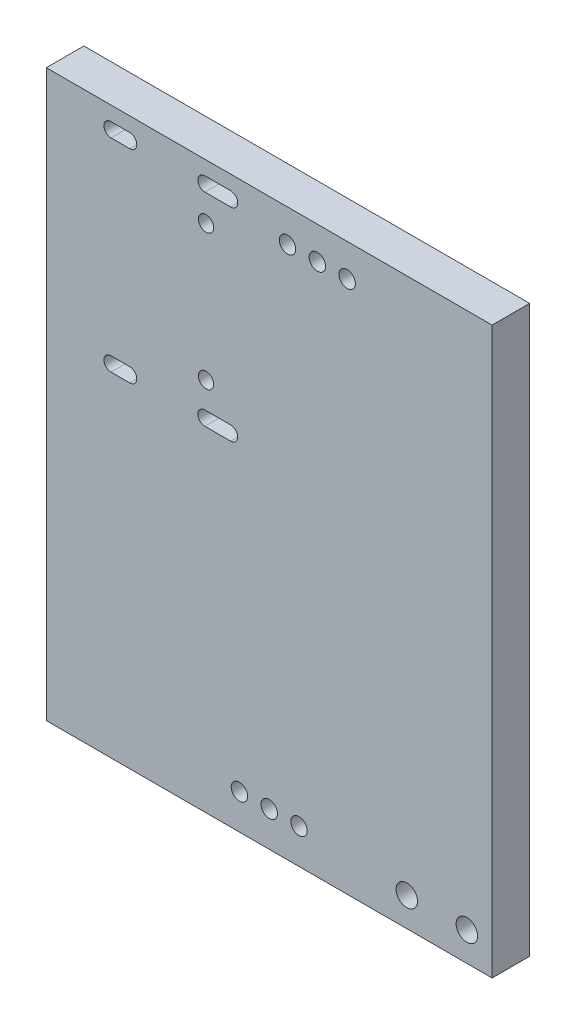
ISO-10303-21;
HEADER;
FILE_DESCRIPTION(('STEP AP214'),'2;1');
FILE_NAME('part.step','',(''),(''),'','','');
FILE_SCHEMA(('AUTOMOTIVE_DESIGN { 1 0 10303 214 1 1 1 1 }'));
ENDSEC;
DATA;
#1=APPLICATION_CONTEXT('core data for automotive mechanical design processes');
#2=APPLICATION_PROTOCOL_DEFINITION('international standard','automotive_design',2000,#1);
#3=PRODUCT_CONTEXT('',#1,'mechanical');
#4=PRODUCT('Part','Part','',(#3));
#5=PRODUCT_RELATED_PRODUCT_CATEGORY('part','',(#4));
#6=PRODUCT_DEFINITION_FORMATION('','',#4);
#7=PRODUCT_DEFINITION_CONTEXT('part definition',#1,'design');
#8=PRODUCT_DEFINITION('design','',#6,#7);
#9=PRODUCT_DEFINITION_SHAPE('','',#8);
#10=(LENGTH_UNIT() NAMED_UNIT(*) SI_UNIT(.MILLI.,.METRE.));
#11=(NAMED_UNIT(*) PLANE_ANGLE_UNIT() SI_UNIT($,.RADIAN.));
#12=(NAMED_UNIT(*) SI_UNIT($,.STERADIAN.) SOLID_ANGLE_UNIT());
#13=UNCERTAINTY_MEASURE_WITH_UNIT(LENGTH_MEASURE(1.E-05),#10,'distance_accuracy_value','');
#14=(GEOMETRIC_REPRESENTATION_CONTEXT(3) GLOBAL_UNCERTAINTY_ASSIGNED_CONTEXT((#13)) GLOBAL_UNIT_ASSIGNED_CONTEXT((#10,
#11,#12)) REPRESENTATION_CONTEXT('',''));
#15=CARTESIAN_POINT('',(0.,0.,0.));
#16=DIRECTION('',(0.,0.,1.));
#17=DIRECTION('',(1.,0.,0.));
#18=AXIS2_PLACEMENT_3D('',#15,#16,#17);
#19=CARTESIAN_POINT('',(-8.790662941326,19.526245872492,0.));
#20=DIRECTION('',(0.,0.,-1.));
#21=DIRECTION('',(-1.,0.,0.));
#22=AXIS2_PLACEMENT_3D('',#19,#20,#21);
#23=CYLINDRICAL_SURFACE('',#22,0.3);
#24=CARTESIAN_POINT('',(-8.790662941326,19.526245872492,1.600028244856));
#25=DIRECTION('',(0.,0.,-1.));
#26=DIRECTION('',(-1.,0.,0.));
#27=AXIS2_PLACEMENT_3D('',#24,#25,#26);
#28=CIRCLE('',#27,0.3);
#29=CARTESIAN_POINT('',(-8.790662941326,19.226245872492,1.600028244856));
#30=VERTEX_POINT('',#29);
#31=CARTESIAN_POINT('',(-8.790662941326,19.826245872492,1.600028244856));
#32=VERTEX_POINT('',#31);
#33=EDGE_CURVE('E144',#30,#32,#28,.T.);
#34=ORIENTED_EDGE('',*,*,#33,.F.);
#35=DIRECTION('',(0.,0.,1.));
#36=VECTOR('',#35,1.);
#37=CARTESIAN_POINT('',(-8.790662941326,19.226245872492,0.));
#38=LINE('',#37,#36);
#39=CARTESIAN_POINT('',(-8.790662941326,19.226245872492,0.));
#40=VERTEX_POINT('',#39);
#41=EDGE_CURVE('E146',#40,#30,#38,.T.);
#42=ORIENTED_EDGE('',*,*,#41,.F.);
#43=CARTESIAN_POINT('',(-8.790662941326,19.526245872492,0.));
#44=DIRECTION('',(0.,0.,-1.));
#45=DIRECTION('',(-1.,0.,0.));
#46=AXIS2_PLACEMENT_3D('',#43,#44,#45);
#47=CIRCLE('',#46,0.3);
#48=CARTESIAN_POINT('',(-8.790662941326,19.826245872492,0.));
#49=VERTEX_POINT('',#48);
#50=EDGE_CURVE('E20',#49,#40,#47,.F.);
#51=ORIENTED_EDGE('',*,*,#50,.F.);
#52=DIRECTION('',(0.,0.,-1.));
#53=VECTOR('',#52,1.);
#54=CARTESIAN_POINT('',(-8.790662941326,19.826245872492,0.));
#55=LINE('',#54,#53);
#56=EDGE_CURVE('E151',#32,#49,#55,.T.);
#57=ORIENTED_EDGE('',*,*,#56,.F.);
#58=EDGE_LOOP('',(#34,#42,#51,#57));
#59=FACE_BOUND('',#58,.T.);
#60=ADVANCED_FACE('F17',(#59),#23,.F.);
#61=CARTESIAN_POINT('',(-8.790662941326,10.886164592329,0.));
#62=DIRECTION('',(0.,0.,-1.));
#63=DIRECTION('',(-1.,0.,0.));
#64=AXIS2_PLACEMENT_3D('',#61,#62,#63);
#65=CYLINDRICAL_SURFACE('',#64,0.3);
#66=CARTESIAN_POINT('',(-8.790662941326,10.886164592329,1.600028244856));
#67=DIRECTION('',(0.,0.,-1.));
#68=DIRECTION('',(-1.,0.,0.));
#69=AXIS2_PLACEMENT_3D('',#66,#67,#68);
#70=CIRCLE('',#69,0.3);
#71=CARTESIAN_POINT('',(-8.790662941326,10.586164592329,1.600028244856));
#72=VERTEX_POINT('',#71);
#73=CARTESIAN_POINT('',(-8.790662941326,11.186164592329,1.600028244856));
#74=VERTEX_POINT('',#73);
#75=EDGE_CURVE('E192',#72,#74,#70,.T.);
#76=ORIENTED_EDGE('',*,*,#75,.F.);
#77=DIRECTION('',(0.,0.,1.));
#78=VECTOR('',#77,1.);
#79=CARTESIAN_POINT('',(-8.790662941326,10.586164592329,0.));
#80=LINE('',#79,#78);
#81=CARTESIAN_POINT('',(-8.790662941326,10.586164592329,0.));
#82=VERTEX_POINT('',#81);
#83=EDGE_CURVE('E185',#82,#72,#80,.T.);
#84=ORIENTED_EDGE('',*,*,#83,.F.);
#85=CARTESIAN_POINT('',(-8.790662941326,10.886164592329,0.));
#86=DIRECTION('',(0.,0.,-1.));
#87=DIRECTION('',(-1.,0.,0.));
#88=AXIS2_PLACEMENT_3D('',#85,#86,#87);
#89=CIRCLE('',#88,0.3);
#90=CARTESIAN_POINT('',(-8.790662941326,11.186164592329,0.));
#91=VERTEX_POINT('',#90);
#92=EDGE_CURVE('E294',#91,#82,#89,.F.);
#93=ORIENTED_EDGE('',*,*,#92,.F.);
#94=DIRECTION('',(0.,0.,-1.));
#95=VECTOR('',#94,1.);
#96=CARTESIAN_POINT('',(-8.790662941326,11.186164592329,0.));
#97=LINE('',#96,#95);
#98=EDGE_CURVE('E188',#74,#91,#97,.T.);
#99=ORIENTED_EDGE('',*,*,#98,.F.);
#100=EDGE_LOOP('',(#76,#84,#93,#99));
#101=FACE_BOUND('',#100,.T.);
#102=ADVANCED_FACE('F716',(#101),#65,.F.);
#103=CARTESIAN_POINT('',(-7.990662941326,19.826245872492,0.));
#104=DIRECTION('',(0.,-1.,0.));
#105=DIRECTION('',(0.,0.,-1.));
#106=AXIS2_PLACEMENT_3D('',#103,#104,#105);
#107=PLANE('',#106);
#108=ORIENTED_EDGE('',*,*,#56,.T.);
#109=DIRECTION('',(-1.,0.,0.));
#110=VECTOR('',#109,1.);
#111=CARTESIAN_POINT('',(-2.049004318009,19.826245872492,0.));
#112=LINE('',#111,#110);
#113=CARTESIAN_POINT('',(-7.990662941326,19.826245872492,0.));
#114=VERTEX_POINT('',#113);
#115=EDGE_CURVE('E143',#114,#49,#112,.T.);
#116=ORIENTED_EDGE('',*,*,#115,.F.);
#117=DIRECTION('',(0.,0.,-1.));
#118=VECTOR('',#117,1.);
#119=CARTESIAN_POINT('',(-7.990662941326,19.826245872492,0.));
#120=LINE('',#119,#118);
#121=CARTESIAN_POINT('',(-7.990662941326,19.826245872492,1.600028244856));
#122=VERTEX_POINT('',#121);
#123=EDGE_CURVE('E283',#114,#122,#120,.F.);
#124=ORIENTED_EDGE('',*,*,#123,.T.);
#125=DIRECTION('',(1.,0.,0.));
#126=VECTOR('',#125,1.);
#127=CARTESIAN_POINT('',(-7.990662941326,19.826245872492,1.600028244856));
#128=LINE('',#127,#126);
#129=EDGE_CURVE('E190',#122,#32,#128,.F.);
#130=ORIENTED_EDGE('',*,*,#129,.T.);
#131=EDGE_LOOP('',(#108,#116,#124,#130));
#132=FACE_BOUND('',#131,.T.);
#133=ADVANCED_FACE('F301',(#132),#107,.T.);
#134=CARTESIAN_POINT('',(-8.790662941326,19.226245872492,0.));
#135=DIRECTION('',(0.,1.,0.));
#136=DIRECTION('',(0.,0.,1.));
#137=AXIS2_PLACEMENT_3D('',#134,#135,#136);
#138=PLANE('',#137);
#139=DIRECTION('',(0.,0.,-1.));
#140=VECTOR('',#139,1.);
#141=CARTESIAN_POINT('',(-7.990662941326,19.226245872492,0.));
#142=LINE('',#141,#140);
#143=CARTESIAN_POINT('',(-7.990662941326,19.226245872492,1.600028244856));
#144=VERTEX_POINT('',#143);
#145=CARTESIAN_POINT('',(-7.990662941326,19.226245872492,0.));
#146=VERTEX_POINT('',#145);
#147=EDGE_CURVE('E156',#144,#146,#142,.T.);
#148=ORIENTED_EDGE('',*,*,#147,.T.);
#149=DIRECTION('',(-1.,0.,0.));
#150=VECTOR('',#149,1.);
#151=CARTESIAN_POINT('',(-2.049004318009,19.226245872492,0.));
#152=LINE('',#151,#150);
#153=EDGE_CURVE('E141',#40,#146,#152,.F.);
#154=ORIENTED_EDGE('',*,*,#153,.F.);
#155=ORIENTED_EDGE('',*,*,#41,.T.);
#156=DIRECTION('',(1.,0.,0.));
#157=VECTOR('',#156,1.);
#158=CARTESIAN_POINT('',(-8.790662941326,19.226245872492,1.600028244856));
#159=LINE('',#158,#157);
#160=EDGE_CURVE('E150',#30,#144,#159,.T.);
#161=ORIENTED_EDGE('',*,*,#160,.T.);
#162=EDGE_LOOP('',(#148,#154,#155,#161));
#163=FACE_BOUND('',#162,.T.);
#164=ADVANCED_FACE('F154',(#163),#138,.T.);
#165=CARTESIAN_POINT('',(-7.990662941326,11.186164592329,0.));
#166=DIRECTION('',(0.,-1.,0.));
#167=DIRECTION('',(0.,0.,-1.));
#168=AXIS2_PLACEMENT_3D('',#165,#166,#167);
#169=PLANE('',#168);
#170=ORIENTED_EDGE('',*,*,#98,.T.);
#171=DIRECTION('',(-1.,0.,0.));
#172=VECTOR('',#171,1.);
#173=CARTESIAN_POINT('',(-2.049004318009,11.186164592329,0.));
#174=LINE('',#173,#172);
#175=CARTESIAN_POINT('',(-7.990662941326,11.186164592329,0.));
#176=VERTEX_POINT('',#175);
#177=EDGE_CURVE('E157',#176,#91,#174,.T.);
#178=ORIENTED_EDGE('',*,*,#177,.F.);
#179=DIRECTION('',(0.,0.,-1.));
#180=VECTOR('',#179,1.);
#181=CARTESIAN_POINT('',(-7.990662941326,11.186164592329,0.));
#182=LINE('',#181,#180);
#183=CARTESIAN_POINT('',(-7.990662941326,11.186164592329,1.600028244856));
#184=VERTEX_POINT('',#183);
#185=EDGE_CURVE('E280',#176,#184,#182,.F.);
#186=ORIENTED_EDGE('',*,*,#185,.T.);
#187=DIRECTION('',(1.,0.,0.));
#188=VECTOR('',#187,1.);
#189=CARTESIAN_POINT('',(-7.990662941326,11.186164592329,1.600028244856));
#190=LINE('',#189,#188);
#191=EDGE_CURVE('E186',#184,#74,#190,.F.);
#192=ORIENTED_EDGE('',*,*,#191,.T.);
#193=EDGE_LOOP('',(#170,#178,#186,#192));
#194=FACE_BOUND('',#193,.T.);
#195=ADVANCED_FACE('F690',(#194),#169,.T.);
#196=CARTESIAN_POINT('',(-8.790662941326,10.586164592329,0.));
#197=DIRECTION('',(0.,1.,0.));
#198=DIRECTION('',(0.,0.,1.));
#199=AXIS2_PLACEMENT_3D('',#196,#197,#198);
#200=PLANE('',#199);
#201=DIRECTION('',(0.,0.,-1.));
#202=VECTOR('',#201,1.);
#203=CARTESIAN_POINT('',(-7.990662941326,10.586164592329,0.));
#204=LINE('',#203,#202);
#205=CARTESIAN_POINT('',(-7.990662941326,10.586164592329,1.600028244856));
#206=VERTEX_POINT('',#205);
#207=CARTESIAN_POINT('',(-7.990662941326,10.586164592329,0.));
#208=VERTEX_POINT('',#207);
#209=EDGE_CURVE('E340',#206,#208,#204,.T.);
#210=ORIENTED_EDGE('',*,*,#209,.T.);
#211=DIRECTION('',(-1.,0.,0.));
#212=VECTOR('',#211,1.);
#213=CARTESIAN_POINT('',(-2.049004318009,10.586164592329,0.));
#214=LINE('',#213,#212);
#215=EDGE_CURVE('E160',#82,#208,#214,.F.);
#216=ORIENTED_EDGE('',*,*,#215,.F.);
#217=ORIENTED_EDGE('',*,*,#83,.T.);
#218=DIRECTION('',(1.,0.,0.));
#219=VECTOR('',#218,1.);
#220=CARTESIAN_POINT('',(-8.790662941326,10.586164592329,1.600028244856));
#221=LINE('',#220,#219);
#222=EDGE_CURVE('E182',#72,#206,#221,.T.);
#223=ORIENTED_EDGE('',*,*,#222,.T.);
#224=EDGE_LOOP('',(#210,#216,#217,#223));
#225=FACE_BOUND('',#224,.T.);
#226=ADVANCED_FACE('F343',(#225),#200,.T.);
#227=CARTESIAN_POINT('',(-4.790815341631,19.526245872492,0.));
#228=DIRECTION('',(0.,0.,-1.));
#229=DIRECTION('',(-1.,0.,0.));
#230=AXIS2_PLACEMENT_3D('',#227,#228,#229);
#231=CYLINDRICAL_SURFACE('',#230,0.3);
#232=CARTESIAN_POINT('',(-4.790815341631,19.526245872492,1.600028244856));
#233=DIRECTION('',(0.,0.,-1.));
#234=DIRECTION('',(-1.,0.,0.));
#235=AXIS2_PLACEMENT_3D('',#232,#233,#234);
#236=CIRCLE('',#235,0.3);
#237=CARTESIAN_POINT('',(-4.790815341631,19.226245872492,1.600028244856));
#238=VERTEX_POINT('',#237);
#239=CARTESIAN_POINT('',(-4.790815341631,19.826245872492,1.600028244856));
#240=VERTEX_POINT('',#239);
#241=EDGE_CURVE('E184',#238,#240,#236,.T.);
#242=ORIENTED_EDGE('',*,*,#241,.F.);
#243=DIRECTION('',(0.,0.,1.));
#244=VECTOR('',#243,1.);
#245=CARTESIAN_POINT('',(-4.790815341631,19.226245872492,0.));
#246=LINE('',#245,#244);
#247=CARTESIAN_POINT('',(-4.790815341631,19.226245872492,0.));
#248=VERTEX_POINT('',#247);
#249=EDGE_CURVE('E178',#248,#238,#246,.T.);
#250=ORIENTED_EDGE('',*,*,#249,.F.);
#251=CARTESIAN_POINT('',(-4.790815341631,19.526245872492,0.));
#252=DIRECTION('',(0.,0.,-1.));
#253=DIRECTION('',(-1.,0.,0.));
#254=AXIS2_PLACEMENT_3D('',#251,#252,#253);
#255=CIRCLE('',#254,0.3);
#256=CARTESIAN_POINT('',(-4.790815341631,19.826245872492,0.));
#257=VERTEX_POINT('',#256);
#258=EDGE_CURVE('E288',#257,#248,#255,.F.);
#259=ORIENTED_EDGE('',*,*,#258,.F.);
#260=DIRECTION('',(0.,0.,-1.));
#261=VECTOR('',#260,1.);
#262=CARTESIAN_POINT('',(-4.790815341631,19.826245872492,0.));
#263=LINE('',#262,#261);
#264=EDGE_CURVE('E181',#240,#257,#263,.T.);
#265=ORIENTED_EDGE('',*,*,#264,.F.);
#266=EDGE_LOOP('',(#242,#250,#259,#265));
#267=FACE_BOUND('',#266,.T.);
#268=ADVANCED_FACE('F673',(#267),#231,.F.);
#269=CARTESIAN_POINT('',(-4.790815341631,10.886164592329,0.));
#270=DIRECTION('',(0.,0.,-1.));
#271=DIRECTION('',(-1.,0.,0.));
#272=AXIS2_PLACEMENT_3D('',#269,#270,#271);
#273=CYLINDRICAL_SURFACE('',#272,0.3);
#274=CARTESIAN_POINT('',(-4.790815341631,10.886164592329,1.600028244856));
#275=DIRECTION('',(0.,0.,-1.));
#276=DIRECTION('',(-1.,0.,0.));
#277=AXIS2_PLACEMENT_3D('',#274,#275,#276);
#278=CIRCLE('',#277,0.3);
#279=CARTESIAN_POINT('',(-4.790815341631,10.586164592329,1.600028244856));
#280=VERTEX_POINT('',#279);
#281=CARTESIAN_POINT('',(-4.790815341631,11.186164592329,1.600028244856));
#282=VERTEX_POINT('',#281);
#283=EDGE_CURVE('E162',#280,#282,#278,.T.);
#284=ORIENTED_EDGE('',*,*,#283,.F.);
#285=DIRECTION('',(0.,0.,1.));
#286=VECTOR('',#285,1.);
#287=CARTESIAN_POINT('',(-4.790815341631,10.586164592329,0.));
#288=LINE('',#287,#286);
#289=CARTESIAN_POINT('',(-4.790815341631,10.586164592329,0.));
#290=VERTEX_POINT('',#289);
#291=EDGE_CURVE('E170',#290,#280,#288,.T.);
#292=ORIENTED_EDGE('',*,*,#291,.F.);
#293=CARTESIAN_POINT('',(-4.790815341631,10.886164592329,0.));
#294=DIRECTION('',(0.,0.,-1.));
#295=DIRECTION('',(-1.,0.,0.));
#296=AXIS2_PLACEMENT_3D('',#293,#294,#295);
#297=CIRCLE('',#296,0.3);
#298=CARTESIAN_POINT('',(-4.790815341631,11.186164592329,0.));
#299=VERTEX_POINT('',#298);
#300=EDGE_CURVE('E285',#299,#290,#297,.F.);
#301=ORIENTED_EDGE('',*,*,#300,.F.);
#302=DIRECTION('',(0.,0.,-1.));
#303=VECTOR('',#302,1.);
#304=CARTESIAN_POINT('',(-4.790815341631,11.186164592329,0.));
#305=LINE('',#304,#303);
#306=EDGE_CURVE('E173',#282,#299,#305,.T.);
#307=ORIENTED_EDGE('',*,*,#306,.F.);
#308=EDGE_LOOP('',(#284,#292,#301,#307));
#309=FACE_BOUND('',#308,.T.);
#310=ADVANCED_FACE('F394',(#309),#273,.F.);
#311=CARTESIAN_POINT('',(-2.049004318009,8.394079248158,0.));
#312=DIRECTION('',(0.,0.,-1.));
#313=DIRECTION('',(-1.,0.,0.));
#314=AXIS2_PLACEMENT_3D('',#311,#312,#313);
#315=PLANE('',#314);
#316=CARTESIAN_POINT('',(6.371145542291,-2.41300482601,0.));
#317=DIRECTION('',(0.,0.,-1.));
#318=DIRECTION('',(-1.,0.,0.));
#319=AXIS2_PLACEMENT_3D('',#316,#317,#318);
#320=CIRCLE('',#319,0.457200914402);
#321=CARTESIAN_POINT('',(5.913944627889,-2.41300482601,0.));
#322=VERTEX_POINT('',#321);
#323=EDGE_CURVE('E240',#322,#322,#320,.F.);
#324=ORIENTED_EDGE('',*,*,#323,.T.);
#325=EDGE_LOOP('',(#324));
#326=FACE_BOUND('',#325,.T.);
#327=CARTESIAN_POINT('',(3.810007620015,-2.41300482601,0.));
#328=DIRECTION('',(0.,0.,-1.));
#329=DIRECTION('',(-1.,0.,0.));
#330=AXIS2_PLACEMENT_3D('',#327,#328,#329);
#331=CIRCLE('',#330,0.457200914402);
#332=CARTESIAN_POINT('',(3.352806705613,-2.41300482601,0.));
#333=VERTEX_POINT('',#332);
#334=EDGE_CURVE('E244',#333,#333,#331,.F.);
#335=ORIENTED_EDGE('',*,*,#334,.T.);
#336=EDGE_LOOP('',(#335));
#337=FACE_BOUND('',#336,.T.);
#338=CARTESIAN_POINT('',(1.270002540005,19.050038100076,0.));
#339=DIRECTION('',(0.,0.,-1.));
#340=DIRECTION('',(-1.,0.,0.));
#341=AXIS2_PLACEMENT_3D('',#338,#339,#340);
#342=CIRCLE('',#341,0.350012700025);
#343=CARTESIAN_POINT('',(0.91998983998,19.050038100076,0.));
#344=VERTEX_POINT('',#343);
#345=EDGE_CURVE('E247',#344,#344,#342,.F.);
#346=ORIENTED_EDGE('',*,*,#345,.T.);
#347=EDGE_LOOP('',(#346));
#348=FACE_BOUND('',#347,.T.);
#349=CARTESIAN_POINT('',(0.,19.050038100076,0.));
#350=DIRECTION('',(0.,0.,-1.));
#351=DIRECTION('',(-1.,0.,0.));
#352=AXIS2_PLACEMENT_3D('',#349,#350,#351);
#353=CIRCLE('',#352,0.350012700025);
#354=CARTESIAN_POINT('',(-0.350012700025,19.050038100076,0.));
#355=VERTEX_POINT('',#354);
#356=EDGE_CURVE('E250',#355,#355,#353,.F.);
#357=ORIENTED_EDGE('',*,*,#356,.T.);
#358=EDGE_LOOP('',(#357));
#359=FACE_BOUND('',#358,.T.);
#360=CARTESIAN_POINT('',(-0.77887477775,-2.159004318009,0.));
#361=DIRECTION('',(0.,0.,-1.));
#362=DIRECTION('',(-1.,0.,0.));
#363=AXIS2_PLACEMENT_3D('',#360,#361,#362);
#364=CIRCLE('',#363,0.350012700025);
#365=CARTESIAN_POINT('',(-1.128887477775,-2.159004318009,0.));
#366=VERTEX_POINT('',#365);
#367=EDGE_CURVE('E253',#366,#366,#364,.F.);
#368=ORIENTED_EDGE('',*,*,#367,.T.);
#369=EDGE_LOOP('',(#368));
#370=FACE_BOUND('',#369,.T.);
#371=CARTESIAN_POINT('',(-1.270002540005,19.050038100076,0.));
#372=DIRECTION('',(0.,0.,-1.));
#373=DIRECTION('',(-1.,0.,0.));
#374=AXIS2_PLACEMENT_3D('',#371,#372,#373);
#375=CIRCLE('',#374,0.350012700025);
#376=CARTESIAN_POINT('',(-1.62001524003,19.050038100076,0.));
#377=VERTEX_POINT('',#376);
#378=EDGE_CURVE('E256',#377,#377,#375,.F.);
#379=ORIENTED_EDGE('',*,*,#378,.T.);
#380=EDGE_LOOP('',(#379));
#381=FACE_BOUND('',#380,.T.);
#382=CARTESIAN_POINT('',(-2.048877317755,-2.159004318009,0.));
#383=DIRECTION('',(0.,0.,-1.));
#384=DIRECTION('',(-1.,0.,0.));
#385=AXIS2_PLACEMENT_3D('',#382,#383,#384);
#386=CIRCLE('',#385,0.350012700025);
#387=CARTESIAN_POINT('',(-2.39889001778,-2.159004318009,0.));
#388=VERTEX_POINT('',#387);
#389=EDGE_CURVE('E259',#388,#388,#386,.F.);
#390=ORIENTED_EDGE('',*,*,#389,.T.);
#391=EDGE_LOOP('',(#390));
#392=FACE_BOUND('',#391,.T.);
#393=CARTESIAN_POINT('',(-3.31887985776,-2.159004318009,0.));
#394=DIRECTION('',(0.,0.,-1.));
#395=DIRECTION('',(-1.,0.,0.));
#396=AXIS2_PLACEMENT_3D('',#393,#394,#395);
#397=CIRCLE('',#396,0.350012700025);
#398=CARTESIAN_POINT('',(-3.668892557785,-2.159004318009,0.));
#399=VERTEX_POINT('',#398);
#400=EDGE_CURVE('E262',#399,#399,#397,.F.);
#401=ORIENTED_EDGE('',*,*,#400,.T.);
#402=EDGE_LOOP('',(#401));
#403=FACE_BOUND('',#402,.T.);
#404=CARTESIAN_POINT('',(-4.740167640335,18.096223012446,0.));
#405=DIRECTION('',(0.,0.,-1.));
#406=DIRECTION('',(-1.,0.,0.));
#407=AXIS2_PLACEMENT_3D('',#404,#405,#406);
#408=CIRCLE('',#407,0.324993649987);
#409=CARTESIAN_POINT('',(-5.065161290322,18.096223012446,0.));
#410=VERTEX_POINT('',#409);
#411=EDGE_CURVE('E265',#410,#410,#408,.F.);
#412=ORIENTED_EDGE('',*,*,#411,.T.);
#413=EDGE_LOOP('',(#412));
#414=FACE_BOUND('',#413,.T.);
#415=CARTESIAN_POINT('',(-4.740167640335,12.316187452375,0.));
#416=DIRECTION('',(0.,0.,-1.));
#417=DIRECTION('',(-1.,0.,0.));
#418=AXIS2_PLACEMENT_3D('',#415,#416,#417);
#419=CIRCLE('',#418,0.324993649987);
#420=CARTESIAN_POINT('',(-5.065161290322,12.316187452375,0.));
#421=VERTEX_POINT('',#420);
#422=EDGE_CURVE('E268',#421,#421,#419,.F.);
#423=ORIENTED_EDGE('',*,*,#422,.T.);
#424=EDGE_LOOP('',(#423));
#425=FACE_BOUND('',#424,.T.);
#426=DIRECTION('',(1.,0.,0.));
#427=VECTOR('',#426,1.);
#428=CARTESIAN_POINT('',(-4.790815341631,10.586164592329,0.));
#429=LINE('',#428,#427);
#430=CARTESIAN_POINT('',(-3.69078994158,10.586164592329,0.));
#431=VERTEX_POINT('',#430);
#432=EDGE_CURVE('E166',#431,#290,#429,.F.);
#433=ORIENTED_EDGE('',*,*,#432,.F.);
#434=CARTESIAN_POINT('',(-3.69078994158,10.886164592329,0.));
#435=DIRECTION('',(0.,0.,-1.));
#436=DIRECTION('',(-1.,0.,0.));
#437=AXIS2_PLACEMENT_3D('',#434,#435,#436);
#438=CIRCLE('',#437,0.3);
#439=CARTESIAN_POINT('',(-3.69078994158,11.186164592329,0.));
#440=VERTEX_POINT('',#439);
#441=EDGE_CURVE('E169',#431,#440,#438,.F.);
#442=ORIENTED_EDGE('',*,*,#441,.T.);
#443=DIRECTION('',(1.,0.,0.));
#444=VECTOR('',#443,1.);
#445=CARTESIAN_POINT('',(-3.69078994158,11.186164592329,0.));
#446=LINE('',#445,#444);
#447=EDGE_CURVE('E171',#299,#440,#446,.T.);
#448=ORIENTED_EDGE('',*,*,#447,.F.);
#449=ORIENTED_EDGE('',*,*,#300,.T.);
#450=EDGE_LOOP('',(#433,#442,#448,#449));
#451=FACE_BOUND('',#450,.T.);
#452=DIRECTION('',(1.,0.,0.));
#453=VECTOR('',#452,1.);
#454=CARTESIAN_POINT('',(-4.790815341631,19.226245872492,0.));
#455=LINE('',#454,#453);
#456=CARTESIAN_POINT('',(-3.69078994158,19.226245872492,0.));
#457=VERTEX_POINT('',#456);
#458=EDGE_CURVE('E174',#457,#248,#455,.F.);
#459=ORIENTED_EDGE('',*,*,#458,.F.);
#460=CARTESIAN_POINT('',(-3.69078994158,19.526245872492,0.));
#461=DIRECTION('',(0.,0.,-1.));
#462=DIRECTION('',(-1.,0.,0.));
#463=AXIS2_PLACEMENT_3D('',#460,#461,#462);
#464=CIRCLE('',#463,0.3);
#465=CARTESIAN_POINT('',(-3.69078994158,19.826245872492,0.));
#466=VERTEX_POINT('',#465);
#467=EDGE_CURVE('E177',#457,#466,#464,.F.);
#468=ORIENTED_EDGE('',*,*,#467,.T.);
#469=DIRECTION('',(1.,0.,0.));
#470=VECTOR('',#469,1.);
#471=CARTESIAN_POINT('',(-3.69078994158,19.826245872492,0.));
#472=LINE('',#471,#470);
#473=EDGE_CURVE('E179',#257,#466,#472,.T.);
#474=ORIENTED_EDGE('',*,*,#473,.F.);
#475=ORIENTED_EDGE('',*,*,#258,.T.);
#476=EDGE_LOOP('',(#459,#468,#474,#475));
#477=FACE_BOUND('',#476,.T.);
#478=ORIENTED_EDGE('',*,*,#215,.T.);
#479=CARTESIAN_POINT('',(-7.990662941326,10.886164592329,0.));
#480=DIRECTION('',(0.,0.,-1.));
#481=DIRECTION('',(-1.,0.,0.));
#482=AXIS2_PLACEMENT_3D('',#479,#480,#481);
#483=CIRCLE('',#482,0.3);
#484=EDGE_CURVE('E277',#208,#176,#483,.F.);
#485=ORIENTED_EDGE('',*,*,#484,.T.);
#486=ORIENTED_EDGE('',*,*,#177,.T.);
#487=ORIENTED_EDGE('',*,*,#92,.T.);
#488=EDGE_LOOP('',(#478,#485,#486,#487));
#489=FACE_BOUND('',#488,.T.);
#490=ORIENTED_EDGE('',*,*,#153,.T.);
#491=CARTESIAN_POINT('',(-7.990662941326,19.526245872492,0.));
#492=DIRECTION('',(0.,0.,-1.));
#493=DIRECTION('',(-1.,0.,0.));
#494=AXIS2_PLACEMENT_3D('',#491,#492,#493);
#495=CIRCLE('',#494,0.3);
#496=EDGE_CURVE('E281',#146,#114,#495,.F.);
#497=ORIENTED_EDGE('',*,*,#496,.T.);
#498=ORIENTED_EDGE('',*,*,#115,.T.);
#499=ORIENTED_EDGE('',*,*,#50,.T.);
#500=EDGE_LOOP('',(#490,#497,#498,#499));
#501=FACE_BOUND('',#500,.T.);
#502=DIRECTION('',(1.,0.,0.));
#503=VECTOR('',#502,1.);
#504=CARTESIAN_POINT('',(7.446314452629,-3.649286258573,0.));
#505=LINE('',#504,#503);
#506=CARTESIAN_POINT('',(-11.54432308864,-3.649286258573,0.));
#507=VERTEX_POINT('',#506);
#508=CARTESIAN_POINT('',(7.446314452629,-3.649286258573,0.));
#509=VERTEX_POINT('',#508);
#510=EDGE_CURVE('E317',#507,#509,#505,.T.);
#511=ORIENTED_EDGE('',*,*,#510,.F.);
#512=DIRECTION('',(0.,1.,0.));
#513=VECTOR('',#512,1.);
#514=CARTESIAN_POINT('',(-11.54432308864,-3.649286258573,0.));
#515=LINE('',#514,#513);
#516=CARTESIAN_POINT('',(-11.54432308864,20.43744475489,0.));
#517=VERTEX_POINT('',#516);
#518=EDGE_CURVE('E284',#517,#507,#515,.F.);
#519=ORIENTED_EDGE('',*,*,#518,.F.);
#520=DIRECTION('',(1.,0.,0.));
#521=VECTOR('',#520,1.);
#522=CARTESIAN_POINT('',(-11.54432308864,20.43744475489,0.));
#523=LINE('',#522,#521);
#524=CARTESIAN_POINT('',(7.446314452629,20.43744475489,0.));
#525=VERTEX_POINT('',#524);
#526=EDGE_CURVE('E287',#525,#517,#523,.F.);
#527=ORIENTED_EDGE('',*,*,#526,.F.);
#528=DIRECTION('',(0.,1.,0.));
#529=VECTOR('',#528,1.);
#530=CARTESIAN_POINT('',(7.446314452629,20.43744475489,0.));
#531=LINE('',#530,#529);
#532=EDGE_CURVE('E323',#509,#525,#531,.T.);
#533=ORIENTED_EDGE('',*,*,#532,.F.);
#534=EDGE_LOOP('',(#511,#519,#527,#533));
#535=FACE_BOUND('',#534,.T.);
#536=ADVANCED_FACE('F137',(#326,#337,#348,#359,#370,#381,#392,#403,#414,#425,#451,#477,#489,
#501,#535),#315,.T.);
#537=CARTESIAN_POINT('',(-11.54432308864,20.43744475489,0.));
#538=DIRECTION('',(0.,1.,0.));
#539=DIRECTION('',(0.,0.,1.));
#540=AXIS2_PLACEMENT_3D('',#537,#538,#539);
#541=PLANE('',#540);
#542=DIRECTION('',(0.,0.,1.));
#543=VECTOR('',#542,1.);
#544=CARTESIAN_POINT('',(7.446314452629,20.43744475489,0.));
#545=LINE('',#544,#543);
#546=CARTESIAN_POINT('',(7.446314452629,20.43744475489,1.600028244856));
#547=VERTEX_POINT('',#546);
#548=EDGE_CURVE('E326',#525,#547,#545,.T.);
#549=ORIENTED_EDGE('',*,*,#548,.F.);
#550=ORIENTED_EDGE('',*,*,#526,.T.);
#551=DIRECTION('',(0.,0.,1.));
#552=VECTOR('',#551,1.);
#553=CARTESIAN_POINT('',(-11.54432308864,20.43744475489,0.));
#554=LINE('',#553,#552);
#555=CARTESIAN_POINT('',(-11.54432308864,20.43744475489,1.600028244856));
#556=VERTEX_POINT('',#555);
#557=EDGE_CURVE('E311',#556,#517,#554,.F.);
#558=ORIENTED_EDGE('',*,*,#557,.F.);
#559=DIRECTION('',(-1.,0.,0.));
#560=VECTOR('',#559,1.);
#561=CARTESIAN_POINT('',(-2.049004318009,20.43744475489,1.600028244856));
#562=LINE('',#561,#560);
#563=EDGE_CURVE('E243',#556,#547,#562,.F.);
#564=ORIENTED_EDGE('',*,*,#563,.T.);
#565=EDGE_LOOP('',(#549,#550,#558,#564));
#566=FACE_BOUND('',#565,.T.);
#567=ADVANCED_FACE('F644',(#566),#541,.T.);
#568=CARTESIAN_POINT('',(7.446314452629,20.43744475489,0.));
#569=DIRECTION('',(1.,0.,0.));
#570=DIRECTION('',(0.,1.,0.));
#571=AXIS2_PLACEMENT_3D('',#568,#569,#570);
#572=PLANE('',#571);
#573=DIRECTION('',(0.,0.,-1.));
#574=VECTOR('',#573,1.);
#575=CARTESIAN_POINT('',(7.446314452629,-3.649286258573,0.));
#576=LINE('',#575,#574);
#577=CARTESIAN_POINT('',(7.446314452629,-3.649286258573,1.600028244856));
#578=VERTEX_POINT('',#577);
#579=EDGE_CURVE('E320',#509,#578,#576,.F.);
#580=ORIENTED_EDGE('',*,*,#579,.F.);
#581=ORIENTED_EDGE('',*,*,#532,.T.);
#582=ORIENTED_EDGE('',*,*,#548,.T.);
#583=DIRECTION('',(0.,1.,0.));
#584=VECTOR('',#583,1.);
#585=CARTESIAN_POINT('',(7.446314452629,8.394079248158,1.600028244856));
#586=LINE('',#585,#584);
#587=EDGE_CURVE('E363',#547,#578,#586,.F.);
#588=ORIENTED_EDGE('',*,*,#587,.T.);
#589=EDGE_LOOP('',(#580,#581,#582,#588));
#590=FACE_BOUND('',#589,.T.);
#591=ADVANCED_FACE('F634',(#590),#572,.T.);
#592=CARTESIAN_POINT('',(7.446314452629,-3.649286258573,0.));
#593=DIRECTION('',(0.,-1.,0.));
#594=DIRECTION('',(0.,0.,-1.));
#595=AXIS2_PLACEMENT_3D('',#592,#593,#594);
#596=PLANE('',#595);
#597=DIRECTION('',(0.,0.,1.));
#598=VECTOR('',#597,1.);
#599=CARTESIAN_POINT('',(-11.54432308864,-3.649286258573,0.));
#600=LINE('',#599,#598);
#601=CARTESIAN_POINT('',(-11.54432308864,-3.649286258573,1.600028244856));
#602=VERTEX_POINT('',#601);
#603=EDGE_CURVE('E314',#507,#602,#600,.T.);
#604=ORIENTED_EDGE('',*,*,#603,.F.);
#605=ORIENTED_EDGE('',*,*,#510,.T.);
#606=ORIENTED_EDGE('',*,*,#579,.T.);
#607=DIRECTION('',(-1.,0.,0.));
#608=VECTOR('',#607,1.);
#609=CARTESIAN_POINT('',(-2.049004318009,-3.649286258573,1.600028244856));
#610=LINE('',#609,#608);
#611=EDGE_CURVE('E366',#578,#602,#610,.T.);
#612=ORIENTED_EDGE('',*,*,#611,.T.);
#613=EDGE_LOOP('',(#604,#605,#606,#612));
#614=FACE_BOUND('',#613,.T.);
#615=ADVANCED_FACE('F624',(#614),#596,.T.);
#616=CARTESIAN_POINT('',(-11.54432308864,-3.649286258573,0.));
#617=DIRECTION('',(-1.,0.,0.));
#618=DIRECTION('',(0.,0.,1.));
#619=AXIS2_PLACEMENT_3D('',#616,#617,#618);
#620=PLANE('',#619);
#621=ORIENTED_EDGE('',*,*,#557,.T.);
#622=ORIENTED_EDGE('',*,*,#518,.T.);
#623=ORIENTED_EDGE('',*,*,#603,.T.);
#624=DIRECTION('',(0.,1.,0.));
#625=VECTOR('',#624,1.);
#626=CARTESIAN_POINT('',(-11.54432308864,8.394079248158,1.600028244856));
#627=LINE('',#626,#625);
#628=EDGE_CURVE('E239',#602,#556,#627,.T.);
#629=ORIENTED_EDGE('',*,*,#628,.T.);
#630=EDGE_LOOP('',(#621,#622,#623,#629));
#631=FACE_BOUND('',#630,.T.);
#632=ADVANCED_FACE('F615',(#631),#620,.T.);
#633=CARTESIAN_POINT('',(-7.990662941326,19.526245872492,0.));
#634=DIRECTION('',(0.,0.,-1.));
#635=DIRECTION('',(-1.,0.,0.));
#636=AXIS2_PLACEMENT_3D('',#633,#634,#635);
#637=CYLINDRICAL_SURFACE('',#636,0.3);
#638=CARTESIAN_POINT('',(-7.990662941326,19.526245872492,1.600028244856));
#639=DIRECTION('',(0.,0.,-1.));
#640=DIRECTION('',(-1.,0.,0.));
#641=AXIS2_PLACEMENT_3D('',#638,#639,#640);
#642=CIRCLE('',#641,0.3);
#643=EDGE_CURVE('E236',#144,#122,#642,.F.);
#644=ORIENTED_EDGE('',*,*,#643,.T.);
#645=ORIENTED_EDGE('',*,*,#123,.F.);
#646=ORIENTED_EDGE('',*,*,#496,.F.);
#647=ORIENTED_EDGE('',*,*,#147,.F.);
#648=EDGE_LOOP('',(#644,#645,#646,#647));
#649=FACE_BOUND('',#648,.T.);
#650=ADVANCED_FACE('F305',(#649),#637,.F.);
#651=CARTESIAN_POINT('',(-7.990662941326,10.886164592329,0.));
#652=DIRECTION('',(0.,0.,-1.));
#653=DIRECTION('',(-1.,0.,0.));
#654=AXIS2_PLACEMENT_3D('',#651,#652,#653);
#655=CYLINDRICAL_SURFACE('',#654,0.3);
#656=CARTESIAN_POINT('',(-7.990662941326,10.886164592329,1.600028244856));
#657=DIRECTION('',(0.,0.,-1.));
#658=DIRECTION('',(-1.,0.,0.));
#659=AXIS2_PLACEMENT_3D('',#656,#657,#658);
#660=CIRCLE('',#659,0.3);
#661=EDGE_CURVE('E232',#206,#184,#660,.F.);
#662=ORIENTED_EDGE('',*,*,#661,.T.);
#663=ORIENTED_EDGE('',*,*,#185,.F.);
#664=ORIENTED_EDGE('',*,*,#484,.F.);
#665=ORIENTED_EDGE('',*,*,#209,.F.);
#666=EDGE_LOOP('',(#662,#663,#664,#665));
#667=FACE_BOUND('',#666,.T.);
#668=ADVANCED_FACE('F339',(#667),#655,.F.);
#669=CARTESIAN_POINT('',(-3.69078994158,19.826245872492,0.));
#670=DIRECTION('',(0.,-1.,0.));
#671=DIRECTION('',(0.,0.,-1.));
#672=AXIS2_PLACEMENT_3D('',#669,#670,#671);
#673=PLANE('',#672);
#674=ORIENTED_EDGE('',*,*,#264,.T.);
#675=ORIENTED_EDGE('',*,*,#473,.T.);
#676=DIRECTION('',(0.,0.,-1.));
#677=VECTOR('',#676,1.);
#678=CARTESIAN_POINT('',(-3.69078994158,19.826245872492,0.));
#679=LINE('',#678,#677);
#680=CARTESIAN_POINT('',(-3.69078994158,19.826245872492,1.600028244856));
#681=VERTEX_POINT('',#680);
#682=EDGE_CURVE('E276',#466,#681,#679,.F.);
#683=ORIENTED_EDGE('',*,*,#682,.T.);
#684=DIRECTION('',(-1.,0.,0.));
#685=VECTOR('',#684,1.);
#686=CARTESIAN_POINT('',(-2.049004318009,19.826245872492,1.600028244856));
#687=LINE('',#686,#685);
#688=EDGE_CURVE('E235',#681,#240,#687,.T.);
#689=ORIENTED_EDGE('',*,*,#688,.T.);
#690=EDGE_LOOP('',(#674,#675,#683,#689));
#691=FACE_BOUND('',#690,.T.);
#692=ADVANCED_FACE('F588',(#691),#673,.T.);
#693=CARTESIAN_POINT('',(-4.790815341631,19.226245872492,0.));
#694=DIRECTION('',(0.,1.,0.));
#695=DIRECTION('',(0.,0.,1.));
#696=AXIS2_PLACEMENT_3D('',#693,#694,#695);
#697=PLANE('',#696);
#698=DIRECTION('',(0.,0.,-1.));
#699=VECTOR('',#698,1.);
#700=CARTESIAN_POINT('',(-3.69078994158,19.226245872492,0.));
#701=LINE('',#700,#699);
#702=CARTESIAN_POINT('',(-3.69078994158,19.226245872492,1.600028244856));
#703=VERTEX_POINT('',#702);
#704=EDGE_CURVE('E350',#703,#457,#701,.T.);
#705=ORIENTED_EDGE('',*,*,#704,.T.);
#706=ORIENTED_EDGE('',*,*,#458,.T.);
#707=ORIENTED_EDGE('',*,*,#249,.T.);
#708=DIRECTION('',(-1.,0.,0.));
#709=VECTOR('',#708,1.);
#710=CARTESIAN_POINT('',(-2.049004318009,19.226245872492,1.600028244856));
#711=LINE('',#710,#709);
#712=EDGE_CURVE('E231',#238,#703,#711,.F.);
#713=ORIENTED_EDGE('',*,*,#712,.T.);
#714=EDGE_LOOP('',(#705,#706,#707,#713));
#715=FACE_BOUND('',#714,.T.);
#716=ADVANCED_FACE('F405',(#715),#697,.T.);
#717=CARTESIAN_POINT('',(-3.69078994158,19.526245872492,0.));
#718=DIRECTION('',(0.,0.,-1.));
#719=DIRECTION('',(-1.,0.,0.));
#720=AXIS2_PLACEMENT_3D('',#717,#718,#719);
#721=CYLINDRICAL_SURFACE('',#720,0.3);
#722=CARTESIAN_POINT('',(-3.69078994158,19.526245872492,1.600028244856));
#723=DIRECTION('',(0.,0.,-1.));
#724=DIRECTION('',(-1.,0.,0.));
#725=AXIS2_PLACEMENT_3D('',#722,#723,#724);
#726=CIRCLE('',#725,0.3);
#727=EDGE_CURVE('E227',#703,#681,#726,.F.);
#728=ORIENTED_EDGE('',*,*,#727,.T.);
#729=ORIENTED_EDGE('',*,*,#682,.F.);
#730=ORIENTED_EDGE('',*,*,#467,.F.);
#731=ORIENTED_EDGE('',*,*,#704,.F.);
#732=EDGE_LOOP('',(#728,#729,#730,#731));
#733=FACE_BOUND('',#732,.T.);
#734=ADVANCED_FACE('F397',(#733),#721,.F.);
#735=CARTESIAN_POINT('',(-3.69078994158,11.186164592329,0.));
#736=DIRECTION('',(0.,-1.,0.));
#737=DIRECTION('',(0.,0.,-1.));
#738=AXIS2_PLACEMENT_3D('',#735,#736,#737);
#739=PLANE('',#738);
#740=ORIENTED_EDGE('',*,*,#306,.T.);
#741=ORIENTED_EDGE('',*,*,#447,.T.);
#742=DIRECTION('',(0.,0.,-1.));
#743=VECTOR('',#742,1.);
#744=CARTESIAN_POINT('',(-3.69078994158,11.186164592329,0.));
#745=LINE('',#744,#743);
#746=CARTESIAN_POINT('',(-3.69078994158,11.186164592329,1.600028244856));
#747=VERTEX_POINT('',#746);
#748=EDGE_CURVE('E273',#440,#747,#745,.F.);
#749=ORIENTED_EDGE('',*,*,#748,.T.);
#750=DIRECTION('',(-1.,0.,0.));
#751=VECTOR('',#750,1.);
#752=CARTESIAN_POINT('',(-2.049004318009,11.186164592329,1.600028244856));
#753=LINE('',#752,#751);
#754=EDGE_CURVE('E230',#747,#282,#753,.T.);
#755=ORIENTED_EDGE('',*,*,#754,.T.);
#756=EDGE_LOOP('',(#740,#741,#749,#755));
#757=FACE_BOUND('',#756,.T.);
#758=ADVANCED_FACE('F395',(#757),#739,.T.);
#759=CARTESIAN_POINT('',(-4.790815341631,10.586164592329,0.));
#760=DIRECTION('',(0.,1.,0.));
#761=DIRECTION('',(0.,0.,1.));
#762=AXIS2_PLACEMENT_3D('',#759,#760,#761);
#763=PLANE('',#762);
#764=DIRECTION('',(0.,0.,-1.));
#765=VECTOR('',#764,1.);
#766=CARTESIAN_POINT('',(-3.69078994158,10.586164592329,0.));
#767=LINE('',#766,#765);
#768=CARTESIAN_POINT('',(-3.69078994158,10.586164592329,1.600028244856));
#769=VERTEX_POINT('',#768);
#770=EDGE_CURVE('E35',#769,#431,#767,.T.);
#771=ORIENTED_EDGE('',*,*,#770,.T.);
#772=ORIENTED_EDGE('',*,*,#432,.T.);
#773=ORIENTED_EDGE('',*,*,#291,.T.);
#774=DIRECTION('',(-1.,0.,0.));
#775=VECTOR('',#774,1.);
#776=CARTESIAN_POINT('',(-2.049004318009,10.586164592329,1.600028244856));
#777=LINE('',#776,#775);
#778=EDGE_CURVE('E226',#280,#769,#777,.F.);
#779=ORIENTED_EDGE('',*,*,#778,.T.);
#780=EDGE_LOOP('',(#771,#772,#773,#779));
#781=FACE_BOUND('',#780,.T.);
#782=ADVANCED_FACE('F380',(#781),#763,.T.);
#783=CARTESIAN_POINT('',(-3.69078994158,10.886164592329,0.));
#784=DIRECTION('',(0.,0.,-1.));
#785=DIRECTION('',(-1.,0.,0.));
#786=AXIS2_PLACEMENT_3D('',#783,#784,#785);
#787=CYLINDRICAL_SURFACE('',#786,0.3);
#788=CARTESIAN_POINT('',(-3.69078994158,10.886164592329,1.600028244856));
#789=DIRECTION('',(0.,0.,-1.));
#790=DIRECTION('',(-1.,0.,0.));
#791=AXIS2_PLACEMENT_3D('',#788,#789,#790);
#792=CIRCLE('',#791,0.3);
#793=EDGE_CURVE('E224',#769,#747,#792,.F.);
#794=ORIENTED_EDGE('',*,*,#793,.T.);
#795=ORIENTED_EDGE('',*,*,#748,.F.);
#796=ORIENTED_EDGE('',*,*,#441,.F.);
#797=ORIENTED_EDGE('',*,*,#770,.F.);
#798=EDGE_LOOP('',(#794,#795,#796,#797));
#799=FACE_BOUND('',#798,.T.);
#800=ADVANCED_FACE('F386',(#799),#787,.F.);
#801=CARTESIAN_POINT('',(-4.740167640335,12.316187452375,0.));
#802=DIRECTION('',(0.,0.,-1.));
#803=DIRECTION('',(-1.,0.,0.));
#804=AXIS2_PLACEMENT_3D('',#801,#802,#803);
#805=CYLINDRICAL_SURFACE('',#804,0.324993649987);
#806=CARTESIAN_POINT('',(-4.740167640335,12.316187452375,1.600028244856));
#807=DIRECTION('',(0.,0.,-1.));
#808=DIRECTION('',(-1.,0.,0.));
#809=AXIS2_PLACEMENT_3D('',#806,#807,#808);
#810=CIRCLE('',#809,0.324993649987);
#811=CARTESIAN_POINT('',(-5.065161290322,12.316187452375,1.600028244856));
#812=VERTEX_POINT('',#811);
#813=EDGE_CURVE('E221',#812,#812,#810,.F.);
#814=ORIENTED_EDGE('',*,*,#813,.T.);
#815=EDGE_LOOP('',(#814));
#816=FACE_BOUND('',#815,.T.);
#817=ORIENTED_EDGE('',*,*,#422,.F.);
#818=EDGE_LOOP('',(#817));
#819=FACE_BOUND('',#818,.T.);
#820=ADVANCED_FACE('F451',(#816,#819),#805,.F.);
#821=CARTESIAN_POINT('',(-4.740167640335,18.096223012446,0.));
#822=DIRECTION('',(0.,0.,-1.));
#823=DIRECTION('',(-1.,0.,0.));
#824=AXIS2_PLACEMENT_3D('',#821,#822,#823);
#825=CYLINDRICAL_SURFACE('',#824,0.324993649987);
#826=CARTESIAN_POINT('',(-4.740167640335,18.096223012446,1.600028244856));
#827=DIRECTION('',(0.,0.,-1.));
#828=DIRECTION('',(-1.,0.,0.));
#829=AXIS2_PLACEMENT_3D('',#826,#827,#828);
#830=CIRCLE('',#829,0.324993649987);
#831=CARTESIAN_POINT('',(-5.065161290322,18.096223012446,1.600028244856));
#832=VERTEX_POINT('',#831);
#833=EDGE_CURVE('E218',#832,#832,#830,.F.);
#834=ORIENTED_EDGE('',*,*,#833,.T.);
#835=EDGE_LOOP('',(#834));
#836=FACE_BOUND('',#835,.T.);
#837=ORIENTED_EDGE('',*,*,#411,.F.);
#838=EDGE_LOOP('',(#837));
#839=FACE_BOUND('',#838,.T.);
#840=ADVANCED_FACE('F447',(#836,#839),#825,.F.);
#841=CARTESIAN_POINT('',(-3.31887985776,-2.159004318009,0.));
#842=DIRECTION('',(0.,0.,-1.));
#843=DIRECTION('',(-1.,0.,0.));
#844=AXIS2_PLACEMENT_3D('',#841,#842,#843);
#845=CYLINDRICAL_SURFACE('',#844,0.350012700025);
#846=CARTESIAN_POINT('',(-3.31887985776,-2.159004318009,1.600028244856));
#847=DIRECTION('',(0.,0.,-1.));
#848=DIRECTION('',(-1.,0.,0.));
#849=AXIS2_PLACEMENT_3D('',#846,#847,#848);
#850=CIRCLE('',#849,0.350012700025);
#851=CARTESIAN_POINT('',(-3.668892557785,-2.159004318009,1.600028244856));
#852=VERTEX_POINT('',#851);
#853=EDGE_CURVE('E215',#852,#852,#850,.F.);
#854=ORIENTED_EDGE('',*,*,#853,.T.);
#855=EDGE_LOOP('',(#854));
#856=FACE_BOUND('',#855,.T.);
#857=ORIENTED_EDGE('',*,*,#400,.F.);
#858=EDGE_LOOP('',(#857));
#859=FACE_BOUND('',#858,.T.);
#860=ADVANCED_FACE('F443',(#856,#859),#845,.F.);
#861=CARTESIAN_POINT('',(-2.048877317755,-2.159004318009,0.));
#862=DIRECTION('',(0.,0.,-1.));
#863=DIRECTION('',(-1.,0.,0.));
#864=AXIS2_PLACEMENT_3D('',#861,#862,#863);
#865=CYLINDRICAL_SURFACE('',#864,0.350012700025);
#866=CARTESIAN_POINT('',(-2.048877317755,-2.159004318009,1.600028244856));
#867=DIRECTION('',(0.,0.,-1.));
#868=DIRECTION('',(-1.,0.,0.));
#869=AXIS2_PLACEMENT_3D('',#866,#867,#868);
#870=CIRCLE('',#869,0.350012700025);
#871=CARTESIAN_POINT('',(-2.39889001778,-2.159004318009,1.600028244856));
#872=VERTEX_POINT('',#871);
#873=EDGE_CURVE('E212',#872,#872,#870,.F.);
#874=ORIENTED_EDGE('',*,*,#873,.T.);
#875=EDGE_LOOP('',(#874));
#876=FACE_BOUND('',#875,.T.);
#877=ORIENTED_EDGE('',*,*,#389,.F.);
#878=EDGE_LOOP('',(#877));
#879=FACE_BOUND('',#878,.T.);
#880=ADVANCED_FACE('F439',(#876,#879),#865,.F.);
#881=CARTESIAN_POINT('',(-1.270002540005,19.050038100076,0.));
#882=DIRECTION('',(0.,0.,-1.));
#883=DIRECTION('',(-1.,0.,0.));
#884=AXIS2_PLACEMENT_3D('',#881,#882,#883);
#885=CYLINDRICAL_SURFACE('',#884,0.350012700025);
#886=CARTESIAN_POINT('',(-1.270002540005,19.050038100076,1.600028244856));
#887=DIRECTION('',(0.,0.,-1.));
#888=DIRECTION('',(-1.,0.,0.));
#889=AXIS2_PLACEMENT_3D('',#886,#887,#888);
#890=CIRCLE('',#889,0.350012700025);
#891=CARTESIAN_POINT('',(-1.62001524003,19.050038100076,1.600028244856));
#892=VERTEX_POINT('',#891);
#893=EDGE_CURVE('E209',#892,#892,#890,.F.);
#894=ORIENTED_EDGE('',*,*,#893,.T.);
#895=EDGE_LOOP('',(#894));
#896=FACE_BOUND('',#895,.T.);
#897=ORIENTED_EDGE('',*,*,#378,.F.);
#898=EDGE_LOOP('',(#897));
#899=FACE_BOUND('',#898,.T.);
#900=ADVANCED_FACE('F435',(#896,#899),#885,.F.);
#901=CARTESIAN_POINT('',(-0.77887477775,-2.159004318009,0.));
#902=DIRECTION('',(0.,0.,-1.));
#903=DIRECTION('',(-1.,0.,0.));
#904=AXIS2_PLACEMENT_3D('',#901,#902,#903);
#905=CYLINDRICAL_SURFACE('',#904,0.350012700025);
#906=CARTESIAN_POINT('',(-0.77887477775,-2.159004318009,1.600028244856));
#907=DIRECTION('',(0.,0.,-1.));
#908=DIRECTION('',(-1.,0.,0.));
#909=AXIS2_PLACEMENT_3D('',#906,#907,#908);
#910=CIRCLE('',#909,0.350012700025);
#911=CARTESIAN_POINT('',(-1.128887477775,-2.159004318009,1.600028244856));
#912=VERTEX_POINT('',#911);
#913=EDGE_CURVE('E206',#912,#912,#910,.F.);
#914=ORIENTED_EDGE('',*,*,#913,.T.);
#915=EDGE_LOOP('',(#914));
#916=FACE_BOUND('',#915,.T.);
#917=ORIENTED_EDGE('',*,*,#367,.F.);
#918=EDGE_LOOP('',(#917));
#919=FACE_BOUND('',#918,.T.);
#920=ADVANCED_FACE('F431',(#916,#919),#905,.F.);
#921=CARTESIAN_POINT('',(0.,19.050038100076,0.));
#922=DIRECTION('',(0.,0.,-1.));
#923=DIRECTION('',(-1.,0.,0.));
#924=AXIS2_PLACEMENT_3D('',#921,#922,#923);
#925=CYLINDRICAL_SURFACE('',#924,0.350012700025);
#926=CARTESIAN_POINT('',(0.,19.050038100076,1.600028244856));
#927=DIRECTION('',(0.,0.,-1.));
#928=DIRECTION('',(-1.,0.,0.));
#929=AXIS2_PLACEMENT_3D('',#926,#927,#928);
#930=CIRCLE('',#929,0.350012700025);
#931=CARTESIAN_POINT('',(-0.350012700025,19.050038100076,1.600028244856));
#932=VERTEX_POINT('',#931);
#933=EDGE_CURVE('E203',#932,#932,#930,.F.);
#934=ORIENTED_EDGE('',*,*,#933,.T.);
#935=EDGE_LOOP('',(#934));
#936=FACE_BOUND('',#935,.T.);
#937=ORIENTED_EDGE('',*,*,#356,.F.);
#938=EDGE_LOOP('',(#937));
#939=FACE_BOUND('',#938,.T.);
#940=ADVANCED_FACE('F427',(#936,#939),#925,.F.);
#941=CARTESIAN_POINT('',(1.270002540005,19.050038100076,0.));
#942=DIRECTION('',(0.,0.,-1.));
#943=DIRECTION('',(-1.,0.,0.));
#944=AXIS2_PLACEMENT_3D('',#941,#942,#943);
#945=CYLINDRICAL_SURFACE('',#944,0.350012700025);
#946=CARTESIAN_POINT('',(1.270002540005,19.050038100076,1.600028244856));
#947=DIRECTION('',(0.,0.,-1.));
#948=DIRECTION('',(-1.,0.,0.));
#949=AXIS2_PLACEMENT_3D('',#946,#947,#948);
#950=CIRCLE('',#949,0.350012700025);
#951=CARTESIAN_POINT('',(0.91998983998,19.050038100076,1.600028244856));
#952=VERTEX_POINT('',#951);
#953=EDGE_CURVE('E200',#952,#952,#950,.F.);
#954=ORIENTED_EDGE('',*,*,#953,.T.);
#955=EDGE_LOOP('',(#954));
#956=FACE_BOUND('',#955,.T.);
#957=ORIENTED_EDGE('',*,*,#345,.F.);
#958=EDGE_LOOP('',(#957));
#959=FACE_BOUND('',#958,.T.);
#960=ADVANCED_FACE('F423',(#956,#959),#945,.F.);
#961=CARTESIAN_POINT('',(3.810007620015,-2.41300482601,0.));
#962=DIRECTION('',(0.,0.,-1.));
#963=DIRECTION('',(-1.,0.,0.));
#964=AXIS2_PLACEMENT_3D('',#961,#962,#963);
#965=CYLINDRICAL_SURFACE('',#964,0.457200914402);
#966=CARTESIAN_POINT('',(3.810007620015,-2.41300482601,1.600028244856));
#967=DIRECTION('',(0.,0.,-1.));
#968=DIRECTION('',(-1.,0.,0.));
#969=AXIS2_PLACEMENT_3D('',#966,#967,#968);
#970=CIRCLE('',#969,0.457200914402);
#971=CARTESIAN_POINT('',(3.352806705613,-2.41300482601,1.600028244856));
#972=VERTEX_POINT('',#971);
#973=EDGE_CURVE('E26',#972,#972,#970,.F.);
#974=ORIENTED_EDGE('',*,*,#973,.T.);
#975=EDGE_LOOP('',(#974));
#976=FACE_BOUND('',#975,.T.);
#977=ORIENTED_EDGE('',*,*,#334,.F.);
#978=EDGE_LOOP('',(#977));
#979=FACE_BOUND('',#978,.T.);
#980=ADVANCED_FACE('F415',(#976,#979),#965,.F.);
#981=CARTESIAN_POINT('',(6.371145542291,-2.41300482601,0.));
#982=DIRECTION('',(0.,0.,-1.));
#983=DIRECTION('',(-1.,0.,0.));
#984=AXIS2_PLACEMENT_3D('',#981,#982,#983);
#985=CYLINDRICAL_SURFACE('',#984,0.457200914402);
#986=CARTESIAN_POINT('',(6.371145542291,-2.41300482601,1.600028244856));
#987=DIRECTION('',(0.,0.,-1.));
#988=DIRECTION('',(-1.,0.,0.));
#989=AXIS2_PLACEMENT_3D('',#986,#987,#988);
#990=CIRCLE('',#989,0.457200914402);
#991=CARTESIAN_POINT('',(5.913944627889,-2.41300482601,1.600028244856));
#992=VERTEX_POINT('',#991);
#993=EDGE_CURVE('E11',#992,#992,#990,.F.);
#994=ORIENTED_EDGE('',*,*,#993,.T.);
#995=EDGE_LOOP('',(#994));
#996=FACE_BOUND('',#995,.T.);
#997=ORIENTED_EDGE('',*,*,#323,.F.);
#998=EDGE_LOOP('',(#997));
#999=FACE_BOUND('',#998,.T.);
#1000=ADVANCED_FACE('F409',(#996,#999),#985,.F.);
#1001=CARTESIAN_POINT('',(-2.049004318009,8.394079248158,1.600028244856));
#1002=DIRECTION('',(0.,0.,-1.));
#1003=DIRECTION('',(-1.,0.,0.));
#1004=AXIS2_PLACEMENT_3D('',#1001,#1002,#1003);
#1005=PLANE('',#1004);
#1006=ORIENTED_EDGE('',*,*,#993,.F.);
#1007=EDGE_LOOP('',(#1006));
#1008=FACE_BOUND('',#1007,.T.);
#1009=ORIENTED_EDGE('',*,*,#973,.F.);
#1010=EDGE_LOOP('',(#1009));
#1011=FACE_BOUND('',#1010,.T.);
#1012=ORIENTED_EDGE('',*,*,#953,.F.);
#1013=EDGE_LOOP('',(#1012));
#1014=FACE_BOUND('',#1013,.T.);
#1015=ORIENTED_EDGE('',*,*,#933,.F.);
#1016=EDGE_LOOP('',(#1015));
#1017=FACE_BOUND('',#1016,.T.);
#1018=ORIENTED_EDGE('',*,*,#913,.F.);
#1019=EDGE_LOOP('',(#1018));
#1020=FACE_BOUND('',#1019,.T.);
#1021=ORIENTED_EDGE('',*,*,#893,.F.);
#1022=EDGE_LOOP('',(#1021));
#1023=FACE_BOUND('',#1022,.T.);
#1024=ORIENTED_EDGE('',*,*,#873,.F.);
#1025=EDGE_LOOP('',(#1024));
#1026=FACE_BOUND('',#1025,.T.);
#1027=ORIENTED_EDGE('',*,*,#853,.F.);
#1028=EDGE_LOOP('',(#1027));
#1029=FACE_BOUND('',#1028,.T.);
#1030=ORIENTED_EDGE('',*,*,#833,.F.);
#1031=EDGE_LOOP('',(#1030));
#1032=FACE_BOUND('',#1031,.T.);
#1033=ORIENTED_EDGE('',*,*,#813,.F.);
#1034=EDGE_LOOP('',(#1033));
#1035=FACE_BOUND('',#1034,.T.);
#1036=ORIENTED_EDGE('',*,*,#778,.F.);
#1037=ORIENTED_EDGE('',*,*,#283,.T.);
#1038=ORIENTED_EDGE('',*,*,#754,.F.);
#1039=ORIENTED_EDGE('',*,*,#793,.F.);
#1040=EDGE_LOOP('',(#1036,#1037,#1038,#1039));
#1041=FACE_BOUND('',#1040,.T.);
#1042=ORIENTED_EDGE('',*,*,#712,.F.);
#1043=ORIENTED_EDGE('',*,*,#241,.T.);
#1044=ORIENTED_EDGE('',*,*,#688,.F.);
#1045=ORIENTED_EDGE('',*,*,#727,.F.);
#1046=EDGE_LOOP('',(#1042,#1043,#1044,#1045));
#1047=FACE_BOUND('',#1046,.T.);
#1048=ORIENTED_EDGE('',*,*,#222,.F.);
#1049=ORIENTED_EDGE('',*,*,#75,.T.);
#1050=ORIENTED_EDGE('',*,*,#191,.F.);
#1051=ORIENTED_EDGE('',*,*,#661,.F.);
#1052=EDGE_LOOP('',(#1048,#1049,#1050,#1051));
#1053=FACE_BOUND('',#1052,.T.);
#1054=ORIENTED_EDGE('',*,*,#160,.F.);
#1055=ORIENTED_EDGE('',*,*,#33,.T.);
#1056=ORIENTED_EDGE('',*,*,#129,.F.);
#1057=ORIENTED_EDGE('',*,*,#643,.F.);
#1058=EDGE_LOOP('',(#1054,#1055,#1056,#1057));
#1059=FACE_BOUND('',#1058,.T.);
#1060=ORIENTED_EDGE('',*,*,#611,.F.);
#1061=ORIENTED_EDGE('',*,*,#587,.F.);
#1062=ORIENTED_EDGE('',*,*,#563,.F.);
#1063=ORIENTED_EDGE('',*,*,#628,.F.);
#1064=EDGE_LOOP('',(#1060,#1061,#1062,#1063));
#1065=FACE_BOUND('',#1064,.T.);
#1066=ADVANCED_FACE('F296',(#1008,#1011,#1014,#1017,#1020,#1023,#1026,#1029,#1032,#1035,#1041,
#1047,#1053,#1059,#1065),#1005,.F.);
#1067=CLOSED_SHELL('',(#60,#102,#133,#164,#195,#226,#268,#310,#536,#567,#591,#615,#632,#650,
#668,#692,#716,#734,#758,#782,#800,#820,#840,#860,#880,#900,#920,#940,#960,#980,#1000,#1066));
#1068=MANIFOLD_SOLID_BREP('B1',#1067);
#1069=ADVANCED_BREP_SHAPE_REPRESENTATION('',(#18,#1068),#14);
#1070=SHAPE_DEFINITION_REPRESENTATION(#9,#1069);
ENDSEC;
END-ISO-10303-21;
